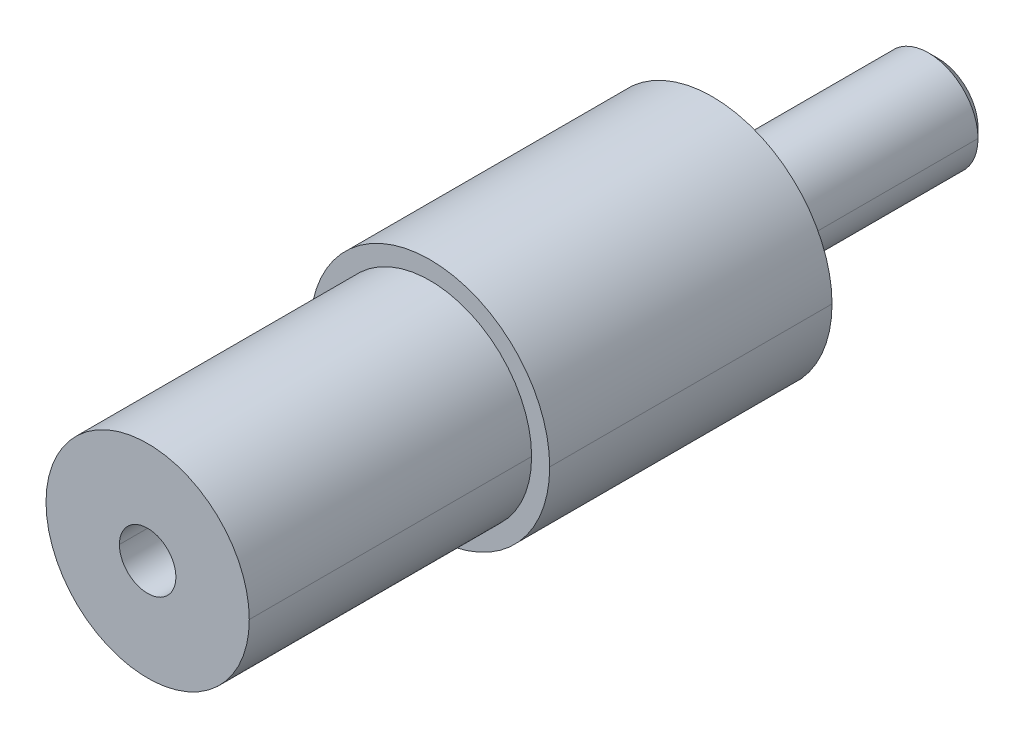
ISO-10303-21;
HEADER;
FILE_DESCRIPTION(('STEP AP214'),'2;1');
FILE_NAME('part.step','',(''),(''),'','','');
FILE_SCHEMA(('AUTOMOTIVE_DESIGN { 1 0 10303 214 1 1 1 1 }'));
ENDSEC;
DATA;
#1=APPLICATION_CONTEXT('core data for automotive mechanical design processes');
#2=APPLICATION_PROTOCOL_DEFINITION('international standard','automotive_design',2000,#1);
#3=PRODUCT_CONTEXT('',#1,'mechanical');
#4=PRODUCT('Part','Part','',(#3));
#5=PRODUCT_RELATED_PRODUCT_CATEGORY('part','',(#4));
#6=PRODUCT_DEFINITION_FORMATION('','',#4);
#7=PRODUCT_DEFINITION_CONTEXT('part definition',#1,'design');
#8=PRODUCT_DEFINITION('design','',#6,#7);
#9=PRODUCT_DEFINITION_SHAPE('','',#8);
#10=(LENGTH_UNIT() NAMED_UNIT(*) SI_UNIT(.MILLI.,.METRE.));
#11=(NAMED_UNIT(*) PLANE_ANGLE_UNIT() SI_UNIT($,.RADIAN.));
#12=(NAMED_UNIT(*) SI_UNIT($,.STERADIAN.) SOLID_ANGLE_UNIT());
#13=UNCERTAINTY_MEASURE_WITH_UNIT(LENGTH_MEASURE(1.E-05),#10,'distance_accuracy_value','');
#14=(GEOMETRIC_REPRESENTATION_CONTEXT(3) GLOBAL_UNCERTAINTY_ASSIGNED_CONTEXT((#13)) GLOBAL_UNIT_ASSIGNED_CONTEXT((#10,
#11,#12)) REPRESENTATION_CONTEXT('',''));
#15=CARTESIAN_POINT('',(0.,0.,0.));
#16=DIRECTION('',(0.,0.,1.));
#17=DIRECTION('',(1.,0.,0.));
#18=AXIS2_PLACEMENT_3D('',#15,#16,#17);
#19=CARTESIAN_POINT('',(0.,0.,0.));
#20=DIRECTION('',(0.,0.,1.));
#21=DIRECTION('',(1.,0.,0.));
#22=AXIS2_PLACEMENT_3D('',#19,#20,#21);
#23=CYLINDRICAL_SURFACE('',#22,5.55625);
#24=CARTESIAN_POINT('',(0.,0.,-24.3205));
#25=DIRECTION('',(0.,0.,1.));
#26=DIRECTION('',(1.,0.,0.));
#27=AXIS2_PLACEMENT_3D('',#24,#25,#26);
#28=CIRCLE('',#27,5.55625);
#29=CARTESIAN_POINT('',(5.55625,0.,-24.3205));
#30=VERTEX_POINT('',#29);
#31=CARTESIAN_POINT('',(-5.55625,0.,-24.3205));
#32=VERTEX_POINT('',#31);
#33=EDGE_CURVE('E11',#30,#32,#28,.T.);
#34=ORIENTED_EDGE('',*,*,#33,.T.);
#35=DIRECTION('',(0.,0.,1.));
#36=VECTOR('',#35,1.);
#37=CARTESIAN_POINT('',(-5.55625,0.,0.));
#38=LINE('',#37,#36);
#39=CARTESIAN_POINT('',(-5.55625,0.,0.));
#40=VERTEX_POINT('',#39);
#41=EDGE_CURVE('E150',#32,#40,#38,.T.);
#42=ORIENTED_EDGE('',*,*,#41,.T.);
#43=CARTESIAN_POINT('',(0.,0.,0.));
#44=DIRECTION('',(0.,0.,1.));
#45=DIRECTION('',(1.,0.,0.));
#46=AXIS2_PLACEMENT_3D('',#43,#44,#45);
#47=CIRCLE('',#46,5.55625);
#48=CARTESIAN_POINT('',(5.55625,0.,0.));
#49=VERTEX_POINT('',#48);
#50=EDGE_CURVE('E163',#49,#40,#47,.T.);
#51=ORIENTED_EDGE('',*,*,#50,.F.);
#52=DIRECTION('',(0.,0.,1.));
#53=VECTOR('',#52,1.);
#54=CARTESIAN_POINT('',(5.55625,0.,0.));
#55=LINE('',#54,#53);
#56=EDGE_CURVE('E127',#30,#49,#55,.T.);
#57=ORIENTED_EDGE('',*,*,#56,.F.);
#58=EDGE_LOOP('',(#34,#42,#51,#57));
#59=FACE_BOUND('',#58,.T.);
#60=ADVANCED_FACE('F16',(#59),#23,.T.);
#61=CARTESIAN_POINT('',(0.,0.,-24.3205));
#62=DIRECTION('',(0.,0.,1.));
#63=DIRECTION('',(1.,0.,0.));
#64=AXIS2_PLACEMENT_3D('',#61,#62,#63);
#65=CONICAL_SURFACE('',#64,5.55625,0.785398163397453);
#66=CARTESIAN_POINT('',(0.,0.,-25.4));
#67=DIRECTION('',(0.,0.,1.));
#68=DIRECTION('',(1.,0.,0.));
#69=AXIS2_PLACEMENT_3D('',#66,#67,#68);
#70=CIRCLE('',#69,4.47675);
#71=CARTESIAN_POINT('',(4.47675,0.,-25.4));
#72=VERTEX_POINT('',#71);
#73=CARTESIAN_POINT('',(-4.47675,0.,-25.4));
#74=VERTEX_POINT('',#73);
#75=EDGE_CURVE('E92',#72,#74,#70,.T.);
#76=ORIENTED_EDGE('',*,*,#75,.T.);
#77=DIRECTION('',(-0.707106781186551,0.,0.707106781186544));
#78=VECTOR('',#77,1.);
#79=CARTESIAN_POINT('',(-5.55625,0.,-24.3205));
#80=LINE('',#79,#78);
#81=EDGE_CURVE('E20',#74,#32,#80,.T.);
#82=ORIENTED_EDGE('',*,*,#81,.T.);
#83=ORIENTED_EDGE('',*,*,#33,.F.);
#84=DIRECTION('',(0.707106781186551,0.,0.707106781186544));
#85=VECTOR('',#84,1.);
#86=CARTESIAN_POINT('',(5.55625,0.,-24.3205));
#87=LINE('',#86,#85);
#88=EDGE_CURVE('E106',#72,#30,#87,.T.);
#89=ORIENTED_EDGE('',*,*,#88,.F.);
#90=EDGE_LOOP('',(#76,#82,#83,#89));
#91=FACE_BOUND('',#90,.T.);
#92=ADVANCED_FACE('F102',(#91),#65,.T.);
#93=CARTESIAN_POINT('',(0.,0.,38.1));
#94=DIRECTION('',(0.,0.,1.));
#95=DIRECTION('',(1.,0.,0.));
#96=AXIS2_PLACEMENT_3D('',#93,#94,#95);
#97=CYLINDRICAL_SURFACE('',#96,3.175);
#98=CARTESIAN_POINT('',(0.,0.,38.1));
#99=DIRECTION('',(0.,0.,1.));
#100=DIRECTION('',(1.,0.,0.));
#101=AXIS2_PLACEMENT_3D('',#98,#99,#100);
#102=CIRCLE('',#101,3.175);
#103=CARTESIAN_POINT('',(-3.175,0.,38.1));
#104=VERTEX_POINT('',#103);
#105=CARTESIAN_POINT('',(3.175,0.,38.1));
#106=VERTEX_POINT('',#105);
#107=EDGE_CURVE('E143',#104,#106,#102,.T.);
#108=ORIENTED_EDGE('',*,*,#107,.F.);
#109=DIRECTION('',(0.,0.,1.));
#110=VECTOR('',#109,1.);
#111=CARTESIAN_POINT('',(-3.175,0.,38.1));
#112=LINE('',#111,#110);
#113=CARTESIAN_POINT('',(-3.175,0.,63.5));
#114=VERTEX_POINT('',#113);
#115=EDGE_CURVE('E144',#104,#114,#112,.T.);
#116=ORIENTED_EDGE('',*,*,#115,.T.);
#117=CARTESIAN_POINT('',(0.,0.,63.5));
#118=DIRECTION('',(0.,0.,1.));
#119=DIRECTION('',(1.,0.,0.));
#120=AXIS2_PLACEMENT_3D('',#117,#118,#119);
#121=CIRCLE('',#120,3.175);
#122=CARTESIAN_POINT('',(3.175,0.,63.5));
#123=VERTEX_POINT('',#122);
#124=EDGE_CURVE('E173',#114,#123,#121,.T.);
#125=ORIENTED_EDGE('',*,*,#124,.T.);
#126=DIRECTION('',(0.,0.,1.));
#127=VECTOR('',#126,1.);
#128=CARTESIAN_POINT('',(3.175,0.,38.1));
#129=LINE('',#128,#127);
#130=EDGE_CURVE('E148',#106,#123,#129,.T.);
#131=ORIENTED_EDGE('',*,*,#130,.F.);
#132=EDGE_LOOP('',(#108,#116,#125,#131));
#133=FACE_BOUND('',#132,.T.);
#134=ADVANCED_FACE('F18',(#133),#97,.F.);
#135=CARTESIAN_POINT('',(0.,0.,63.5));
#136=DIRECTION('',(0.,0.,-1.));
#137=DIRECTION('',(-1.,0.,0.));
#138=AXIS2_PLACEMENT_3D('',#135,#136,#137);
#139=CYLINDRICAL_SURFACE('',#138,11.43);
#140=CARTESIAN_POINT('',(0.,0.,63.5));
#141=DIRECTION('',(0.,0.,1.));
#142=DIRECTION('',(1.,0.,0.));
#143=AXIS2_PLACEMENT_3D('',#140,#141,#142);
#144=CIRCLE('',#143,11.43);
#145=CARTESIAN_POINT('',(11.43,0.,63.5));
#146=VERTEX_POINT('',#145);
#147=CARTESIAN_POINT('',(-11.43,0.,63.5));
#148=VERTEX_POINT('',#147);
#149=EDGE_CURVE('E156',#146,#148,#144,.T.);
#150=ORIENTED_EDGE('',*,*,#149,.F.);
#151=DIRECTION('',(0.,0.,-1.));
#152=VECTOR('',#151,1.);
#153=CARTESIAN_POINT('',(11.43,0.,63.5));
#154=LINE('',#153,#152);
#155=CARTESIAN_POINT('',(11.43,0.,31.75));
#156=VERTEX_POINT('',#155);
#157=EDGE_CURVE('E174',#146,#156,#154,.T.);
#158=ORIENTED_EDGE('',*,*,#157,.T.);
#159=CARTESIAN_POINT('',(0.,0.,31.75));
#160=DIRECTION('',(0.,0.,1.));
#161=DIRECTION('',(1.,0.,0.));
#162=AXIS2_PLACEMENT_3D('',#159,#160,#161);
#163=CIRCLE('',#162,11.43);
#164=CARTESIAN_POINT('',(-11.43,0.,31.75));
#165=VERTEX_POINT('',#164);
#166=EDGE_CURVE('E193',#156,#165,#163,.T.);
#167=ORIENTED_EDGE('',*,*,#166,.T.);
#168=DIRECTION('',(0.,0.,-1.));
#169=VECTOR('',#168,1.);
#170=CARTESIAN_POINT('',(-11.43,0.,63.5));
#171=LINE('',#170,#169);
#172=EDGE_CURVE('E178',#148,#165,#171,.T.);
#173=ORIENTED_EDGE('',*,*,#172,.F.);
#174=EDGE_LOOP('',(#150,#158,#167,#173));
#175=FACE_BOUND('',#174,.T.);
#176=ADVANCED_FACE('F238',(#175),#139,.T.);
#177=CARTESIAN_POINT('',(0.,0.,31.75));
#178=DIRECTION('',(0.,0.,-1.));
#179=DIRECTION('',(-1.,0.,0.));
#180=AXIS2_PLACEMENT_3D('',#177,#178,#179);
#181=CYLINDRICAL_SURFACE('',#180,13.462);
#182=CARTESIAN_POINT('',(0.,0.,31.75));
#183=DIRECTION('',(0.,0.,1.));
#184=DIRECTION('',(1.,0.,0.));
#185=AXIS2_PLACEMENT_3D('',#182,#183,#184);
#186=CIRCLE('',#185,13.462);
#187=CARTESIAN_POINT('',(13.462,0.,31.75));
#188=VERTEX_POINT('',#187);
#189=CARTESIAN_POINT('',(-13.462,0.,31.75));
#190=VERTEX_POINT('',#189);
#191=EDGE_CURVE('E162',#188,#190,#186,.T.);
#192=ORIENTED_EDGE('',*,*,#191,.F.);
#193=DIRECTION('',(0.,0.,-1.));
#194=VECTOR('',#193,1.);
#195=CARTESIAN_POINT('',(13.462,0.,31.75));
#196=LINE('',#195,#194);
#197=CARTESIAN_POINT('',(13.462,0.,0.));
#198=VERTEX_POINT('',#197);
#199=EDGE_CURVE('E42',#188,#198,#196,.T.);
#200=ORIENTED_EDGE('',*,*,#199,.T.);
#201=CARTESIAN_POINT('',(0.,0.,0.));
#202=DIRECTION('',(0.,0.,1.));
#203=DIRECTION('',(1.,0.,0.));
#204=AXIS2_PLACEMENT_3D('',#201,#202,#203);
#205=CIRCLE('',#204,13.462);
#206=CARTESIAN_POINT('',(-13.462,0.,0.));
#207=VERTEX_POINT('',#206);
#208=EDGE_CURVE('E138',#198,#207,#205,.T.);
#209=ORIENTED_EDGE('',*,*,#208,.T.);
#210=DIRECTION('',(0.,0.,-1.));
#211=VECTOR('',#210,1.);
#212=CARTESIAN_POINT('',(-13.462,0.,31.75));
#213=LINE('',#212,#211);
#214=EDGE_CURVE('E27',#190,#207,#213,.T.);
#215=ORIENTED_EDGE('',*,*,#214,.F.);
#216=EDGE_LOOP('',(#192,#200,#209,#215));
#217=FACE_BOUND('',#216,.T.);
#218=ADVANCED_FACE('F234',(#217),#181,.T.);
#219=CARTESIAN_POINT('',(0.,0.,31.75));
#220=DIRECTION('',(0.,0.,-1.));
#221=DIRECTION('',(-1.,0.,0.));
#222=AXIS2_PLACEMENT_3D('',#219,#220,#221);
#223=CYLINDRICAL_SURFACE('',#222,13.462);
#224=ORIENTED_EDGE('',*,*,#199,.F.);
#225=CARTESIAN_POINT('',(0.,0.,31.75));
#226=DIRECTION('',(0.,0.,1.));
#227=DIRECTION('',(1.,0.,0.));
#228=AXIS2_PLACEMENT_3D('',#225,#226,#227);
#229=CIRCLE('',#228,13.462);
#230=EDGE_CURVE('E158',#190,#188,#229,.T.);
#231=ORIENTED_EDGE('',*,*,#230,.F.);
#232=ORIENTED_EDGE('',*,*,#214,.T.);
#233=CARTESIAN_POINT('',(0.,0.,0.));
#234=DIRECTION('',(0.,0.,1.));
#235=DIRECTION('',(1.,0.,0.));
#236=AXIS2_PLACEMENT_3D('',#233,#234,#235);
#237=CIRCLE('',#236,13.462);
#238=EDGE_CURVE('E189',#207,#198,#237,.T.);
#239=ORIENTED_EDGE('',*,*,#238,.T.);
#240=EDGE_LOOP('',(#224,#231,#232,#239));
#241=FACE_BOUND('',#240,.T.);
#242=ADVANCED_FACE('F237',(#241),#223,.T.);
#243=CARTESIAN_POINT('',(0.,0.,31.75));
#244=DIRECTION('',(0.,0.,1.));
#245=DIRECTION('',(1.,0.,0.));
#246=AXIS2_PLACEMENT_3D('',#243,#244,#245);
#247=PLANE('',#246);
#248=CARTESIAN_POINT('',(0.,0.,31.75));
#249=DIRECTION('',(0.,0.,1.));
#250=DIRECTION('',(1.,0.,0.));
#251=AXIS2_PLACEMENT_3D('',#248,#249,#250);
#252=CIRCLE('',#251,11.43);
#253=EDGE_CURVE('E182',#165,#156,#252,.T.);
#254=ORIENTED_EDGE('',*,*,#253,.F.);
#255=ORIENTED_EDGE('',*,*,#166,.F.);
#256=EDGE_LOOP('',(#254,#255));
#257=FACE_BOUND('',#256,.T.);
#258=ORIENTED_EDGE('',*,*,#230,.T.);
#259=ORIENTED_EDGE('',*,*,#191,.T.);
#260=EDGE_LOOP('',(#258,#259));
#261=FACE_BOUND('',#260,.T.);
#262=ADVANCED_FACE('F244',(#257,#261),#247,.T.);
#263=CARTESIAN_POINT('',(0.,0.,0.));
#264=DIRECTION('',(0.,0.,1.));
#265=DIRECTION('',(1.,0.,0.));
#266=AXIS2_PLACEMENT_3D('',#263,#264,#265);
#267=PLANE('',#266);
#268=ORIENTED_EDGE('',*,*,#50,.T.);
#269=CARTESIAN_POINT('',(0.,0.,0.));
#270=DIRECTION('',(0.,0.,1.));
#271=DIRECTION('',(1.,0.,0.));
#272=AXIS2_PLACEMENT_3D('',#269,#270,#271);
#273=CIRCLE('',#272,5.55625);
#274=EDGE_CURVE('E121',#40,#49,#273,.T.);
#275=ORIENTED_EDGE('',*,*,#274,.T.);
#276=EDGE_LOOP('',(#268,#275));
#277=FACE_BOUND('',#276,.T.);
#278=ORIENTED_EDGE('',*,*,#238,.F.);
#279=ORIENTED_EDGE('',*,*,#208,.F.);
#280=EDGE_LOOP('',(#278,#279));
#281=FACE_BOUND('',#280,.T.);
#282=ADVANCED_FACE('F240',(#277,#281),#267,.F.);
#283=CARTESIAN_POINT('',(0.,0.,63.5));
#284=DIRECTION('',(0.,0.,-1.));
#285=DIRECTION('',(-1.,0.,0.));
#286=AXIS2_PLACEMENT_3D('',#283,#284,#285);
#287=CYLINDRICAL_SURFACE('',#286,11.43);
#288=ORIENTED_EDGE('',*,*,#157,.F.);
#289=CARTESIAN_POINT('',(0.,0.,63.5));
#290=DIRECTION('',(0.,0.,1.));
#291=DIRECTION('',(1.,0.,0.));
#292=AXIS2_PLACEMENT_3D('',#289,#290,#291);
#293=CIRCLE('',#292,11.43);
#294=EDGE_CURVE('E152',#148,#146,#293,.T.);
#295=ORIENTED_EDGE('',*,*,#294,.F.);
#296=ORIENTED_EDGE('',*,*,#172,.T.);
#297=ORIENTED_EDGE('',*,*,#253,.T.);
#298=EDGE_LOOP('',(#288,#295,#296,#297));
#299=FACE_BOUND('',#298,.T.);
#300=ADVANCED_FACE('F243',(#299),#287,.T.);
#301=CARTESIAN_POINT('',(0.,0.,63.5));
#302=DIRECTION('',(0.,0.,1.));
#303=DIRECTION('',(1.,0.,0.));
#304=AXIS2_PLACEMENT_3D('',#301,#302,#303);
#305=PLANE('',#304);
#306=CARTESIAN_POINT('',(0.,0.,63.5));
#307=DIRECTION('',(0.,0.,1.));
#308=DIRECTION('',(1.,0.,0.));
#309=AXIS2_PLACEMENT_3D('',#306,#307,#308);
#310=CIRCLE('',#309,3.175);
#311=EDGE_CURVE('E157',#123,#114,#310,.T.);
#312=ORIENTED_EDGE('',*,*,#311,.F.);
#313=ORIENTED_EDGE('',*,*,#124,.F.);
#314=EDGE_LOOP('',(#312,#313));
#315=FACE_BOUND('',#314,.T.);
#316=ORIENTED_EDGE('',*,*,#294,.T.);
#317=ORIENTED_EDGE('',*,*,#149,.T.);
#318=EDGE_LOOP('',(#316,#317));
#319=FACE_BOUND('',#318,.T.);
#320=ADVANCED_FACE('F207',(#315,#319),#305,.T.);
#321=CARTESIAN_POINT('',(0.,0.,38.1));
#322=DIRECTION('',(0.,0.,1.));
#323=DIRECTION('',(1.,0.,0.));
#324=AXIS2_PLACEMENT_3D('',#321,#322,#323);
#325=CYLINDRICAL_SURFACE('',#324,3.175);
#326=ORIENTED_EDGE('',*,*,#115,.F.);
#327=CARTESIAN_POINT('',(0.,0.,38.1));
#328=DIRECTION('',(0.,0.,1.));
#329=DIRECTION('',(1.,0.,0.));
#330=AXIS2_PLACEMENT_3D('',#327,#328,#329);
#331=CIRCLE('',#330,3.175);
#332=EDGE_CURVE('E109',#106,#104,#331,.T.);
#333=ORIENTED_EDGE('',*,*,#332,.F.);
#334=ORIENTED_EDGE('',*,*,#130,.T.);
#335=ORIENTED_EDGE('',*,*,#311,.T.);
#336=EDGE_LOOP('',(#326,#333,#334,#335));
#337=FACE_BOUND('',#336,.T.);
#338=ADVANCED_FACE('F213',(#337),#325,.F.);
#339=CARTESIAN_POINT('',(0.,0.,38.1));
#340=DIRECTION('',(0.,0.,1.));
#341=DIRECTION('',(1.,0.,0.));
#342=AXIS2_PLACEMENT_3D('',#339,#340,#341);
#343=PLANE('',#342);
#344=ORIENTED_EDGE('',*,*,#332,.T.);
#345=ORIENTED_EDGE('',*,*,#107,.T.);
#346=EDGE_LOOP('',(#344,#345));
#347=FACE_BOUND('',#346,.T.);
#348=ADVANCED_FACE('F215',(#347),#343,.T.);
#349=CARTESIAN_POINT('',(4.47675,0.,-25.4));
#350=DIRECTION('',(0.,0.,-1.));
#351=DIRECTION('',(0.,-1.,0.));
#352=AXIS2_PLACEMENT_3D('',#349,#350,#351);
#353=PLANE('',#352);
#354=ORIENTED_EDGE('',*,*,#75,.F.);
#355=CARTESIAN_POINT('',(0.,0.,-25.4));
#356=DIRECTION('',(0.,0.,1.));
#357=DIRECTION('',(1.,0.,0.));
#358=AXIS2_PLACEMENT_3D('',#355,#356,#357);
#359=CIRCLE('',#358,4.47675);
#360=EDGE_CURVE('E111',#74,#72,#359,.T.);
#361=ORIENTED_EDGE('',*,*,#360,.F.);
#362=EDGE_LOOP('',(#354,#361));
#363=FACE_BOUND('',#362,.T.);
#364=ADVANCED_FACE('F112',(#363),#353,.T.);
#365=CARTESIAN_POINT('',(0.,0.,-24.3205));
#366=DIRECTION('',(0.,0.,1.));
#367=DIRECTION('',(1.,0.,0.));
#368=AXIS2_PLACEMENT_3D('',#365,#366,#367);
#369=CONICAL_SURFACE('',#368,5.55625,0.785398163397453);
#370=ORIENTED_EDGE('',*,*,#81,.F.);
#371=ORIENTED_EDGE('',*,*,#360,.T.);
#372=ORIENTED_EDGE('',*,*,#88,.T.);
#373=CARTESIAN_POINT('',(0.,0.,-24.3205));
#374=DIRECTION('',(0.,0.,1.));
#375=DIRECTION('',(1.,0.,0.));
#376=AXIS2_PLACEMENT_3D('',#373,#374,#375);
#377=CIRCLE('',#376,5.55625);
#378=EDGE_CURVE('E118',#32,#30,#377,.T.);
#379=ORIENTED_EDGE('',*,*,#378,.F.);
#380=EDGE_LOOP('',(#370,#371,#372,#379));
#381=FACE_BOUND('',#380,.T.);
#382=ADVANCED_FACE('F116',(#381),#369,.T.);
#383=CARTESIAN_POINT('',(0.,0.,0.));
#384=DIRECTION('',(0.,0.,1.));
#385=DIRECTION('',(1.,0.,0.));
#386=AXIS2_PLACEMENT_3D('',#383,#384,#385);
#387=CYLINDRICAL_SURFACE('',#386,5.55625);
#388=ORIENTED_EDGE('',*,*,#41,.F.);
#389=ORIENTED_EDGE('',*,*,#378,.T.);
#390=ORIENTED_EDGE('',*,*,#56,.T.);
#391=ORIENTED_EDGE('',*,*,#274,.F.);
#392=EDGE_LOOP('',(#388,#389,#390,#391));
#393=FACE_BOUND('',#392,.T.);
#394=ADVANCED_FACE('F251',(#393),#387,.T.);
#395=CLOSED_SHELL('',(#60,#92,#134,#176,#218,#242,#262,#282,#300,#320,#338,#348,#364,#382,#394));
#396=MANIFOLD_SOLID_BREP('B1',#395);
#397=ADVANCED_BREP_SHAPE_REPRESENTATION('',(#18,#396),#14);
#398=SHAPE_DEFINITION_REPRESENTATION(#9,#397);
ENDSEC;
END-ISO-10303-21;
